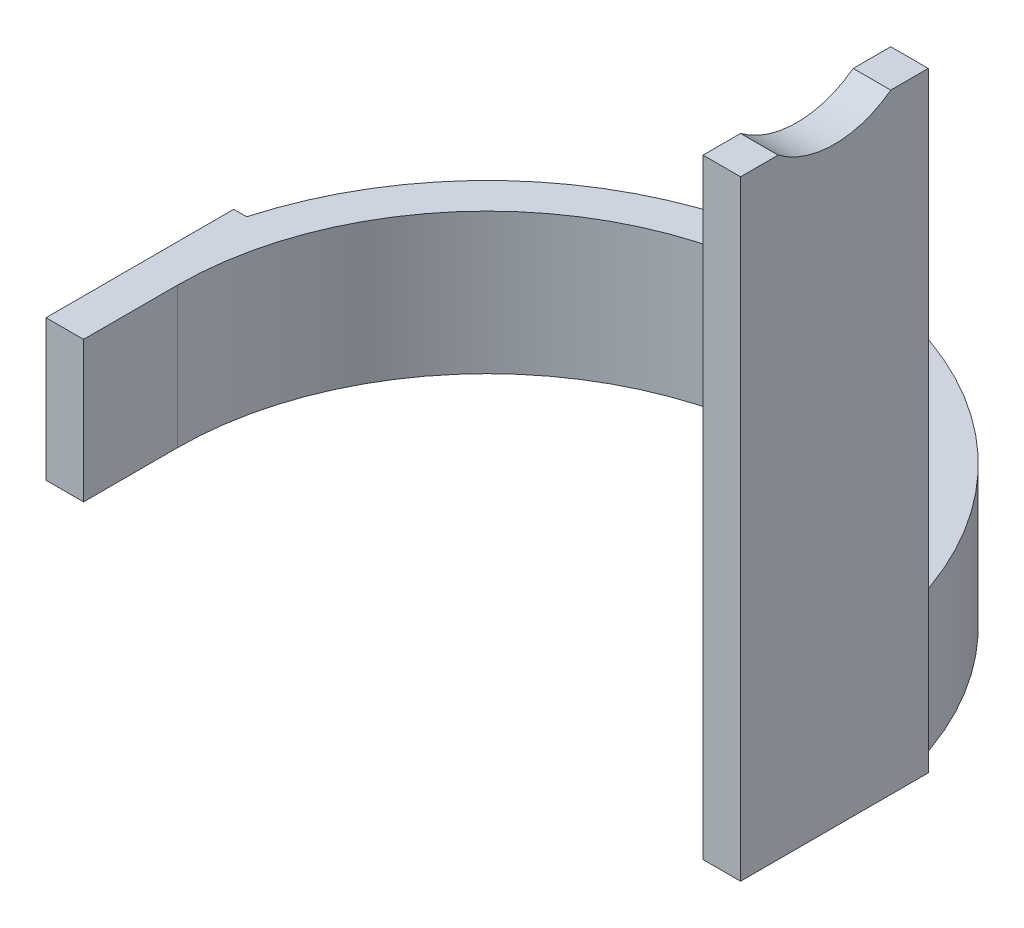
ISO-10303-21;
HEADER;
FILE_DESCRIPTION(('STEP AP214'),'2;1');
FILE_NAME('part.step','',(''),(''),'','','');
FILE_SCHEMA(('AUTOMOTIVE_DESIGN { 1 0 10303 214 1 1 1 1 }'));
ENDSEC;
DATA;
#1=APPLICATION_CONTEXT('core data for automotive mechanical design processes');
#2=APPLICATION_PROTOCOL_DEFINITION('international standard','automotive_design',2000,#1);
#3=PRODUCT_CONTEXT('',#1,'mechanical');
#4=PRODUCT('Part','Part','',(#3));
#5=PRODUCT_RELATED_PRODUCT_CATEGORY('part','',(#4));
#6=PRODUCT_DEFINITION_FORMATION('','',#4);
#7=PRODUCT_DEFINITION_CONTEXT('part definition',#1,'design');
#8=PRODUCT_DEFINITION('design','',#6,#7);
#9=PRODUCT_DEFINITION_SHAPE('','',#8);
#10=(LENGTH_UNIT() NAMED_UNIT(*) SI_UNIT(.MILLI.,.METRE.));
#11=(NAMED_UNIT(*) PLANE_ANGLE_UNIT() SI_UNIT($,.RADIAN.));
#12=(NAMED_UNIT(*) SI_UNIT($,.STERADIAN.) SOLID_ANGLE_UNIT());
#13=UNCERTAINTY_MEASURE_WITH_UNIT(LENGTH_MEASURE(1.E-05),#10,'distance_accuracy_value','');
#14=(GEOMETRIC_REPRESENTATION_CONTEXT(3) GLOBAL_UNCERTAINTY_ASSIGNED_CONTEXT((#13)) GLOBAL_UNIT_ASSIGNED_CONTEXT((#10,
#11,#12)) REPRESENTATION_CONTEXT('',''));
#15=CARTESIAN_POINT('',(0.,0.,0.));
#16=DIRECTION('',(0.,0.,1.));
#17=DIRECTION('',(1.,0.,0.));
#18=AXIS2_PLACEMENT_3D('',#15,#16,#17);
#19=CARTESIAN_POINT('',(0.,130.,0.));
#20=DIRECTION('',(0.,-1.,0.));
#21=DIRECTION('',(0.,0.,-1.));
#22=AXIS2_PLACEMENT_3D('',#19,#20,#21);
#23=PLANE('',#22);
#24=DIRECTION('',(0.,0.,-1.));
#25=VECTOR('',#24,1.);
#26=CARTESIAN_POINT('',(74.,130.,20.));
#27=LINE('',#26,#25);
#28=CARTESIAN_POINT('',(74.,130.,20.));
#29=VERTEX_POINT('',#28);
#30=CARTESIAN_POINT('',(74.,130.,12.));
#31=VERTEX_POINT('',#30);
#32=EDGE_CURVE('E200',#29,#31,#27,.T.);
#33=ORIENTED_EDGE('',*,*,#32,.T.);
#34=DIRECTION('',(-1.,0.,0.));
#35=VECTOR('',#34,1.);
#36=CARTESIAN_POINT('',(74.,130.,12.));
#37=LINE('',#36,#35);
#38=CARTESIAN_POINT('',(66.,130.,12.));
#39=VERTEX_POINT('',#38);
#40=EDGE_CURVE('E47',#31,#39,#37,.T.);
#41=ORIENTED_EDGE('',*,*,#40,.T.);
#42=DIRECTION('',(0.,0.,1.));
#43=VECTOR('',#42,1.);
#44=CARTESIAN_POINT('',(66.,130.,20.));
#45=LINE('',#44,#43);
#46=CARTESIAN_POINT('',(66.,130.,20.));
#47=VERTEX_POINT('',#46);
#48=EDGE_CURVE('E197',#39,#47,#45,.T.);
#49=ORIENTED_EDGE('',*,*,#48,.T.);
#50=DIRECTION('',(1.,0.,0.));
#51=VECTOR('',#50,1.);
#52=CARTESIAN_POINT('',(66.,130.,20.));
#53=LINE('',#52,#51);
#54=EDGE_CURVE('E214',#47,#29,#53,.T.);
#55=ORIENTED_EDGE('',*,*,#54,.T.);
#56=EDGE_LOOP('',(#33,#41,#49,#55));
#57=FACE_BOUND('',#56,.T.);
#58=ADVANCED_FACE('F38',(#57),#23,.F.);
#59=CARTESIAN_POINT('',(0.,30.,0.));
#60=DIRECTION('',(0.,1.,0.));
#61=DIRECTION('',(0.,0.,1.));
#62=AXIS2_PLACEMENT_3D('',#59,#60,#61);
#63=PLANE('',#62);
#64=CARTESIAN_POINT('',(0.,30.,0.));
#65=DIRECTION('',(0.,-1.,0.));
#66=DIRECTION('',(0.,0.,1.));
#67=AXIS2_PLACEMENT_3D('',#64,#65,#66);
#68=CIRCLE('',#67,66.);
#69=CARTESIAN_POINT('',(-66.,30.,0.));
#70=VERTEX_POINT('',#69);
#71=CARTESIAN_POINT('',(66.,30.,0.));
#72=VERTEX_POINT('',#71);
#73=EDGE_CURVE('E233',#70,#72,#68,.T.);
#74=ORIENTED_EDGE('',*,*,#73,.T.);
#75=DIRECTION('',(0.,0.,1.));
#76=VECTOR('',#75,1.);
#77=CARTESIAN_POINT('',(66.,30.,20.));
#78=LINE('',#77,#76);
#79=CARTESIAN_POINT('',(66.,30.,-20.));
#80=VERTEX_POINT('',#79);
#81=EDGE_CURVE('E210',#80,#72,#78,.T.);
#82=ORIENTED_EDGE('',*,*,#81,.F.);
#83=DIRECTION('',(1.,0.,0.));
#84=VECTOR('',#83,1.);
#85=CARTESIAN_POINT('',(0.,30.,-20.));
#86=LINE('',#85,#84);
#87=CARTESIAN_POINT('',(71.2460525222275,30.,-20.));
#88=VERTEX_POINT('',#87);
#89=EDGE_CURVE('E186',#80,#88,#86,.T.);
#90=ORIENTED_EDGE('',*,*,#89,.T.);
#91=CARTESIAN_POINT('',(0.,30.,0.));
#92=DIRECTION('',(0.,1.,0.));
#93=DIRECTION('',(0.,0.,1.));
#94=AXIS2_PLACEMENT_3D('',#91,#92,#93);
#95=CIRCLE('',#94,74.);
#96=CARTESIAN_POINT('',(-71.2460525222275,30.,-20.));
#97=VERTEX_POINT('',#96);
#98=EDGE_CURVE('E136',#88,#97,#95,.T.);
#99=ORIENTED_EDGE('',*,*,#98,.T.);
#100=DIRECTION('',(-1.,0.,0.));
#101=VECTOR('',#100,1.);
#102=CARTESIAN_POINT('',(-64.,30.,-20.));
#103=LINE('',#102,#101);
#104=CARTESIAN_POINT('',(-74.,30.,-20.));
#105=VERTEX_POINT('',#104);
#106=EDGE_CURVE('E131',#97,#105,#103,.T.);
#107=ORIENTED_EDGE('',*,*,#106,.T.);
#108=DIRECTION('',(0.,0.,1.));
#109=VECTOR('',#108,1.);
#110=CARTESIAN_POINT('',(-74.,30.,-20.));
#111=LINE('',#110,#109);
#112=CARTESIAN_POINT('',(-74.,30.,20.));
#113=VERTEX_POINT('',#112);
#114=EDGE_CURVE('E134',#105,#113,#111,.T.);
#115=ORIENTED_EDGE('',*,*,#114,.T.);
#116=DIRECTION('',(-1.,0.,0.));
#117=VECTOR('',#116,1.);
#118=CARTESIAN_POINT('',(-74.,30.,20.));
#119=LINE('',#118,#117);
#120=CARTESIAN_POINT('',(-66.,30.,20.));
#121=VERTEX_POINT('',#120);
#122=EDGE_CURVE('E54',#121,#113,#119,.T.);
#123=ORIENTED_EDGE('',*,*,#122,.F.);
#124=DIRECTION('',(0.,0.,1.));
#125=VECTOR('',#124,1.);
#126=CARTESIAN_POINT('',(-66.,30.,0.));
#127=LINE('',#126,#125);
#128=EDGE_CURVE('E11',#70,#121,#127,.T.);
#129=ORIENTED_EDGE('',*,*,#128,.F.);
#130=EDGE_LOOP('',(#74,#82,#90,#99,#107,#115,#123,#129));
#131=FACE_BOUND('',#130,.T.);
#132=ADVANCED_FACE('F133',(#131),#63,.T.);
#133=CARTESIAN_POINT('',(0.,30.,0.));
#134=DIRECTION('',(0.,-1.,0.));
#135=DIRECTION('',(0.,0.,-1.));
#136=AXIS2_PLACEMENT_3D('',#133,#134,#135);
#137=CYLINDRICAL_SURFACE('',#136,66.);
#138=CARTESIAN_POINT('',(0.,0.,0.));
#139=DIRECTION('',(0.,-1.,0.));
#140=DIRECTION('',(0.,0.,1.));
#141=AXIS2_PLACEMENT_3D('',#138,#139,#140);
#142=CIRCLE('',#141,66.);
#143=CARTESIAN_POINT('',(-66.,0.,0.));
#144=VERTEX_POINT('',#143);
#145=CARTESIAN_POINT('',(66.,0.,0.));
#146=VERTEX_POINT('',#145);
#147=EDGE_CURVE('E232',#144,#146,#142,.T.);
#148=ORIENTED_EDGE('',*,*,#147,.T.);
#149=DIRECTION('',(0.,-1.,0.));
#150=VECTOR('',#149,1.);
#151=CARTESIAN_POINT('',(66.,30.,0.));
#152=LINE('',#151,#150);
#153=EDGE_CURVE('E182',#72,#146,#152,.T.);
#154=ORIENTED_EDGE('',*,*,#153,.F.);
#155=ORIENTED_EDGE('',*,*,#73,.F.);
#156=DIRECTION('',(0.,-1.,0.));
#157=VECTOR('',#156,1.);
#158=CARTESIAN_POINT('',(-66.,30.,0.));
#159=LINE('',#158,#157);
#160=EDGE_CURVE('E239',#70,#144,#159,.T.);
#161=ORIENTED_EDGE('',*,*,#160,.T.);
#162=EDGE_LOOP('',(#148,#154,#155,#161));
#163=FACE_BOUND('',#162,.T.);
#164=ADVANCED_FACE('F40',(#163),#137,.F.);
#165=CARTESIAN_POINT('',(66.,30.,0.));
#166=DIRECTION('',(1.,0.,0.));
#167=DIRECTION('',(0.,0.,-1.));
#168=AXIS2_PLACEMENT_3D('',#165,#166,#167);
#169=PLANE('',#168);
#170=ORIENTED_EDGE('',*,*,#48,.F.);
#171=CARTESIAN_POINT('',(66.,146.,0.));
#172=DIRECTION('',(1.,0.,0.));
#173=DIRECTION('',(0.,0.,-1.));
#174=AXIS2_PLACEMENT_3D('',#171,#172,#173);
#175=CIRCLE('',#174,20.);
#176=CARTESIAN_POINT('',(66.,130.,-12.));
#177=VERTEX_POINT('',#176);
#178=EDGE_CURVE('E205',#39,#177,#175,.T.);
#179=ORIENTED_EDGE('',*,*,#178,.T.);
#180=CARTESIAN_POINT('',(66.,130.,-20.));
#181=VERTEX_POINT('',#180);
#182=EDGE_CURVE('E209',#181,#177,#45,.T.);
#183=ORIENTED_EDGE('',*,*,#182,.F.);
#184=DIRECTION('',(0.,-1.,0.));
#185=VECTOR('',#184,1.);
#186=CARTESIAN_POINT('',(66.,130.,-20.));
#187=LINE('',#186,#185);
#188=EDGE_CURVE('E227',#181,#80,#187,.T.);
#189=ORIENTED_EDGE('',*,*,#188,.T.);
#190=ORIENTED_EDGE('',*,*,#81,.T.);
#191=ORIENTED_EDGE('',*,*,#153,.T.);
#192=DIRECTION('',(0.,0.,1.));
#193=VECTOR('',#192,1.);
#194=CARTESIAN_POINT('',(66.,0.,0.));
#195=LINE('',#194,#193);
#196=CARTESIAN_POINT('',(66.,0.,20.));
#197=VERTEX_POINT('',#196);
#198=EDGE_CURVE('E243',#146,#197,#195,.T.);
#199=ORIENTED_EDGE('',*,*,#198,.T.);
#200=DIRECTION('',(0.,-1.,0.));
#201=VECTOR('',#200,1.);
#202=CARTESIAN_POINT('',(66.,30.,20.));
#203=LINE('',#202,#201);
#204=EDGE_CURVE('E178',#47,#197,#203,.T.);
#205=ORIENTED_EDGE('',*,*,#204,.F.);
#206=EDGE_LOOP('',(#170,#179,#183,#189,#190,#191,#199,#205));
#207=FACE_BOUND('',#206,.T.);
#208=ADVANCED_FACE('F203',(#207),#169,.F.);
#209=CARTESIAN_POINT('',(74.,30.,20.));
#210=DIRECTION('',(0.,0.,-1.));
#211=DIRECTION('',(-1.,0.,0.));
#212=AXIS2_PLACEMENT_3D('',#209,#210,#211);
#213=PLANE('',#212);
#214=DIRECTION('',(1.,0.,0.));
#215=VECTOR('',#214,1.);
#216=CARTESIAN_POINT('',(74.,0.,20.));
#217=LINE('',#216,#215);
#218=CARTESIAN_POINT('',(74.,0.,20.));
#219=VERTEX_POINT('',#218);
#220=EDGE_CURVE('E246',#197,#219,#217,.T.);
#221=ORIENTED_EDGE('',*,*,#220,.T.);
#222=DIRECTION('',(0.,-1.,0.));
#223=VECTOR('',#222,1.);
#224=CARTESIAN_POINT('',(74.,30.,20.));
#225=LINE('',#224,#223);
#226=EDGE_CURVE('E174',#29,#219,#225,.T.);
#227=ORIENTED_EDGE('',*,*,#226,.F.);
#228=ORIENTED_EDGE('',*,*,#54,.F.);
#229=ORIENTED_EDGE('',*,*,#204,.T.);
#230=EDGE_LOOP('',(#221,#227,#228,#229));
#231=FACE_BOUND('',#230,.T.);
#232=ADVANCED_FACE('F394',(#231),#213,.F.);
#233=CARTESIAN_POINT('',(74.,30.,-20.));
#234=DIRECTION('',(-1.,0.,0.));
#235=DIRECTION('',(0.,0.,1.));
#236=AXIS2_PLACEMENT_3D('',#233,#234,#235);
#237=PLANE('',#236);
#238=CARTESIAN_POINT('',(74.,130.,-12.));
#239=VERTEX_POINT('',#238);
#240=CARTESIAN_POINT('',(74.,130.,-20.));
#241=VERTEX_POINT('',#240);
#242=EDGE_CURVE('E222',#239,#241,#27,.T.);
#243=ORIENTED_EDGE('',*,*,#242,.F.);
#244=CARTESIAN_POINT('',(74.,146.,0.));
#245=DIRECTION('',(-1.,0.,0.));
#246=DIRECTION('',(0.,0.,1.));
#247=AXIS2_PLACEMENT_3D('',#244,#245,#246);
#248=CIRCLE('',#247,20.);
#249=EDGE_CURVE('E61',#239,#31,#248,.T.);
#250=ORIENTED_EDGE('',*,*,#249,.T.);
#251=ORIENTED_EDGE('',*,*,#32,.F.);
#252=ORIENTED_EDGE('',*,*,#226,.T.);
#253=DIRECTION('',(0.,0.,-1.));
#254=VECTOR('',#253,1.);
#255=CARTESIAN_POINT('',(74.,0.,-20.));
#256=LINE('',#255,#254);
#257=CARTESIAN_POINT('',(74.,0.,-20.));
#258=VERTEX_POINT('',#257);
#259=EDGE_CURVE('E249',#219,#258,#256,.T.);
#260=ORIENTED_EDGE('',*,*,#259,.T.);
#261=DIRECTION('',(0.,-1.,0.));
#262=VECTOR('',#261,1.);
#263=CARTESIAN_POINT('',(74.,30.,-20.));
#264=LINE('',#263,#262);
#265=EDGE_CURVE('E170',#241,#258,#264,.T.);
#266=ORIENTED_EDGE('',*,*,#265,.F.);
#267=EDGE_LOOP('',(#243,#250,#251,#252,#260,#266));
#268=FACE_BOUND('',#267,.T.);
#269=ADVANCED_FACE('F311',(#268),#237,.F.);
#270=CARTESIAN_POINT('',(74.,30.,-20.));
#271=DIRECTION('',(0.,0.,1.));
#272=DIRECTION('',(1.,0.,0.));
#273=AXIS2_PLACEMENT_3D('',#270,#271,#272);
#274=PLANE('',#273);
#275=DIRECTION('',(-1.,0.,0.));
#276=VECTOR('',#275,1.);
#277=CARTESIAN_POINT('',(74.,0.,-20.));
#278=LINE('',#277,#276);
#279=CARTESIAN_POINT('',(71.2460525222275,0.,-20.));
#280=VERTEX_POINT('',#279);
#281=EDGE_CURVE('E252',#258,#280,#278,.T.);
#282=ORIENTED_EDGE('',*,*,#281,.T.);
#283=DIRECTION('',(0.,-1.,0.));
#284=VECTOR('',#283,1.);
#285=CARTESIAN_POINT('',(71.2460525222275,30.,-20.));
#286=LINE('',#285,#284);
#287=EDGE_CURVE('E161',#88,#280,#286,.T.);
#288=ORIENTED_EDGE('',*,*,#287,.F.);
#289=ORIENTED_EDGE('',*,*,#89,.F.);
#290=ORIENTED_EDGE('',*,*,#188,.F.);
#291=DIRECTION('',(-1.,0.,0.));
#292=VECTOR('',#291,1.);
#293=CARTESIAN_POINT('',(66.,130.,-20.));
#294=LINE('',#293,#292);
#295=EDGE_CURVE('E225',#241,#181,#294,.T.);
#296=ORIENTED_EDGE('',*,*,#295,.F.);
#297=ORIENTED_EDGE('',*,*,#265,.T.);
#298=EDGE_LOOP('',(#282,#288,#289,#290,#296,#297));
#299=FACE_BOUND('',#298,.T.);
#300=ADVANCED_FACE('F291',(#299),#274,.F.);
#301=CARTESIAN_POINT('',(0.,30.,0.));
#302=DIRECTION('',(0.,-1.,0.));
#303=DIRECTION('',(0.,0.,-1.));
#304=AXIS2_PLACEMENT_3D('',#301,#302,#303);
#305=CYLINDRICAL_SURFACE('',#304,74.);
#306=CARTESIAN_POINT('',(0.,0.,0.));
#307=DIRECTION('',(0.,1.,0.));
#308=DIRECTION('',(0.,0.,1.));
#309=AXIS2_PLACEMENT_3D('',#306,#307,#308);
#310=CIRCLE('',#309,74.);
#311=CARTESIAN_POINT('',(-71.2460525222275,0.,-20.));
#312=VERTEX_POINT('',#311);
#313=EDGE_CURVE('E255',#280,#312,#310,.T.);
#314=ORIENTED_EDGE('',*,*,#313,.T.);
#315=DIRECTION('',(0.,-1.,0.));
#316=VECTOR('',#315,1.);
#317=CARTESIAN_POINT('',(-71.2460525222275,30.,-20.));
#318=LINE('',#317,#316);
#319=EDGE_CURVE('E157',#97,#312,#318,.T.);
#320=ORIENTED_EDGE('',*,*,#319,.F.);
#321=ORIENTED_EDGE('',*,*,#98,.F.);
#322=ORIENTED_EDGE('',*,*,#287,.T.);
#323=EDGE_LOOP('',(#314,#320,#321,#322));
#324=FACE_BOUND('',#323,.T.);
#325=ADVANCED_FACE('F302',(#324),#305,.T.);
#326=CARTESIAN_POINT('',(-74.,30.,-20.));
#327=DIRECTION('',(0.,0.,1.));
#328=DIRECTION('',(1.,0.,0.));
#329=AXIS2_PLACEMENT_3D('',#326,#327,#328);
#330=PLANE('',#329);
#331=DIRECTION('',(0.,-1.,0.));
#332=VECTOR('',#331,1.);
#333=CARTESIAN_POINT('',(-74.,30.,-20.));
#334=LINE('',#333,#332);
#335=CARTESIAN_POINT('',(-74.,0.,-20.));
#336=VERTEX_POINT('',#335);
#337=EDGE_CURVE('E147',#105,#336,#334,.T.);
#338=ORIENTED_EDGE('',*,*,#337,.F.);
#339=ORIENTED_EDGE('',*,*,#106,.F.);
#340=ORIENTED_EDGE('',*,*,#319,.T.);
#341=DIRECTION('',(-1.,0.,0.));
#342=VECTOR('',#341,1.);
#343=CARTESIAN_POINT('',(-74.,0.,-20.));
#344=LINE('',#343,#342);
#345=EDGE_CURVE('E154',#312,#336,#344,.T.);
#346=ORIENTED_EDGE('',*,*,#345,.T.);
#347=EDGE_LOOP('',(#338,#339,#340,#346));
#348=FACE_BOUND('',#347,.T.);
#349=ADVANCED_FACE('F152',(#348),#330,.F.);
#350=CARTESIAN_POINT('',(-74.,30.,-20.));
#351=DIRECTION('',(1.,0.,0.));
#352=DIRECTION('',(0.,0.,-1.));
#353=AXIS2_PLACEMENT_3D('',#350,#351,#352);
#354=PLANE('',#353);
#355=DIRECTION('',(0.,-1.,0.));
#356=VECTOR('',#355,1.);
#357=CARTESIAN_POINT('',(-74.,30.,20.));
#358=LINE('',#357,#356);
#359=CARTESIAN_POINT('',(-74.,0.,20.));
#360=VERTEX_POINT('',#359);
#361=EDGE_CURVE('E149',#113,#360,#358,.T.);
#362=ORIENTED_EDGE('',*,*,#361,.F.);
#363=ORIENTED_EDGE('',*,*,#114,.F.);
#364=ORIENTED_EDGE('',*,*,#337,.T.);
#365=DIRECTION('',(0.,0.,1.));
#366=VECTOR('',#365,1.);
#367=CARTESIAN_POINT('',(-74.,0.,-20.));
#368=LINE('',#367,#366);
#369=EDGE_CURVE('E260',#336,#360,#368,.T.);
#370=ORIENTED_EDGE('',*,*,#369,.T.);
#371=EDGE_LOOP('',(#362,#363,#364,#370));
#372=FACE_BOUND('',#371,.T.);
#373=ADVANCED_FACE('F145',(#372),#354,.F.);
#374=CARTESIAN_POINT('',(-74.,30.,20.));
#375=DIRECTION('',(0.,0.,-1.));
#376=DIRECTION('',(-1.,0.,0.));
#377=AXIS2_PLACEMENT_3D('',#374,#375,#376);
#378=PLANE('',#377);
#379=DIRECTION('',(0.,-1.,0.));
#380=VECTOR('',#379,1.);
#381=CARTESIAN_POINT('',(-66.,30.,20.));
#382=LINE('',#381,#380);
#383=CARTESIAN_POINT('',(-66.,0.,20.));
#384=VERTEX_POINT('',#383);
#385=EDGE_CURVE('E163',#121,#384,#382,.T.);
#386=ORIENTED_EDGE('',*,*,#385,.F.);
#387=ORIENTED_EDGE('',*,*,#122,.T.);
#388=ORIENTED_EDGE('',*,*,#361,.T.);
#389=DIRECTION('',(1.,0.,0.));
#390=VECTOR('',#389,1.);
#391=CARTESIAN_POINT('',(-74.,0.,20.));
#392=LINE('',#391,#390);
#393=EDGE_CURVE('E263',#360,#384,#392,.T.);
#394=ORIENTED_EDGE('',*,*,#393,.T.);
#395=EDGE_LOOP('',(#386,#387,#388,#394));
#396=FACE_BOUND('',#395,.T.);
#397=ADVANCED_FACE('F279',(#396),#378,.F.);
#398=CARTESIAN_POINT('',(-66.,30.,0.));
#399=DIRECTION('',(-1.,0.,0.));
#400=DIRECTION('',(0.,0.,1.));
#401=AXIS2_PLACEMENT_3D('',#398,#399,#400);
#402=PLANE('',#401);
#403=ORIENTED_EDGE('',*,*,#160,.F.);
#404=ORIENTED_EDGE('',*,*,#128,.T.);
#405=ORIENTED_EDGE('',*,*,#385,.T.);
#406=DIRECTION('',(0.,0.,-1.));
#407=VECTOR('',#406,1.);
#408=CARTESIAN_POINT('',(-66.,0.,0.));
#409=LINE('',#408,#407);
#410=EDGE_CURVE('E236',#384,#144,#409,.T.);
#411=ORIENTED_EDGE('',*,*,#410,.T.);
#412=EDGE_LOOP('',(#403,#404,#405,#411));
#413=FACE_BOUND('',#412,.T.);
#414=ADVANCED_FACE('F275',(#413),#402,.F.);
#415=CARTESIAN_POINT('',(0.,0.,0.));
#416=DIRECTION('',(0.,1.,0.));
#417=DIRECTION('',(0.,0.,1.));
#418=AXIS2_PLACEMENT_3D('',#415,#416,#417);
#419=PLANE('',#418);
#420=ORIENTED_EDGE('',*,*,#147,.F.);
#421=ORIENTED_EDGE('',*,*,#410,.F.);
#422=ORIENTED_EDGE('',*,*,#393,.F.);
#423=ORIENTED_EDGE('',*,*,#369,.F.);
#424=ORIENTED_EDGE('',*,*,#345,.F.);
#425=ORIENTED_EDGE('',*,*,#313,.F.);
#426=ORIENTED_EDGE('',*,*,#281,.F.);
#427=ORIENTED_EDGE('',*,*,#259,.F.);
#428=ORIENTED_EDGE('',*,*,#220,.F.);
#429=ORIENTED_EDGE('',*,*,#198,.F.);
#430=EDGE_LOOP('',(#420,#421,#422,#423,#424,#425,#426,#427,#428,#429));
#431=FACE_BOUND('',#430,.T.);
#432=ADVANCED_FACE('F282',(#431),#419,.F.);
#433=ORIENTED_EDGE('',*,*,#182,.T.);
#434=DIRECTION('',(-1.,0.,0.));
#435=VECTOR('',#434,1.);
#436=CARTESIAN_POINT('',(74.,130.,-12.));
#437=LINE('',#436,#435);
#438=EDGE_CURVE('E189',#177,#239,#437,.F.);
#439=ORIENTED_EDGE('',*,*,#438,.T.);
#440=ORIENTED_EDGE('',*,*,#242,.T.);
#441=ORIENTED_EDGE('',*,*,#295,.T.);
#442=EDGE_LOOP('',(#433,#439,#440,#441));
#443=FACE_BOUND('',#442,.T.);
#444=ADVANCED_FACE('F294',(#443),#23,.F.);
#445=CARTESIAN_POINT('',(74.,146.,0.));
#446=DIRECTION('',(-1.,0.,0.));
#447=DIRECTION('',(0.,0.,1.));
#448=AXIS2_PLACEMENT_3D('',#445,#446,#447);
#449=CYLINDRICAL_SURFACE('',#448,20.);
#450=ORIENTED_EDGE('',*,*,#249,.F.);
#451=ORIENTED_EDGE('',*,*,#438,.F.);
#452=ORIENTED_EDGE('',*,*,#178,.F.);
#453=ORIENTED_EDGE('',*,*,#40,.F.);
#454=EDGE_LOOP('',(#450,#451,#452,#453));
#455=FACE_BOUND('',#454,.T.);
#456=ADVANCED_FACE('F322',(#455),#449,.F.);
#457=CLOSED_SHELL('',(#58,#132,#164,#208,#232,#269,#300,#325,#349,#373,#397,#414,#432,#444,#456));
#458=MANIFOLD_SOLID_BREP('B2',#457);
#459=ADVANCED_BREP_SHAPE_REPRESENTATION('',(#18,#458),#14);
#460=SHAPE_DEFINITION_REPRESENTATION(#9,#459);
ENDSEC;
END-ISO-10303-21;
